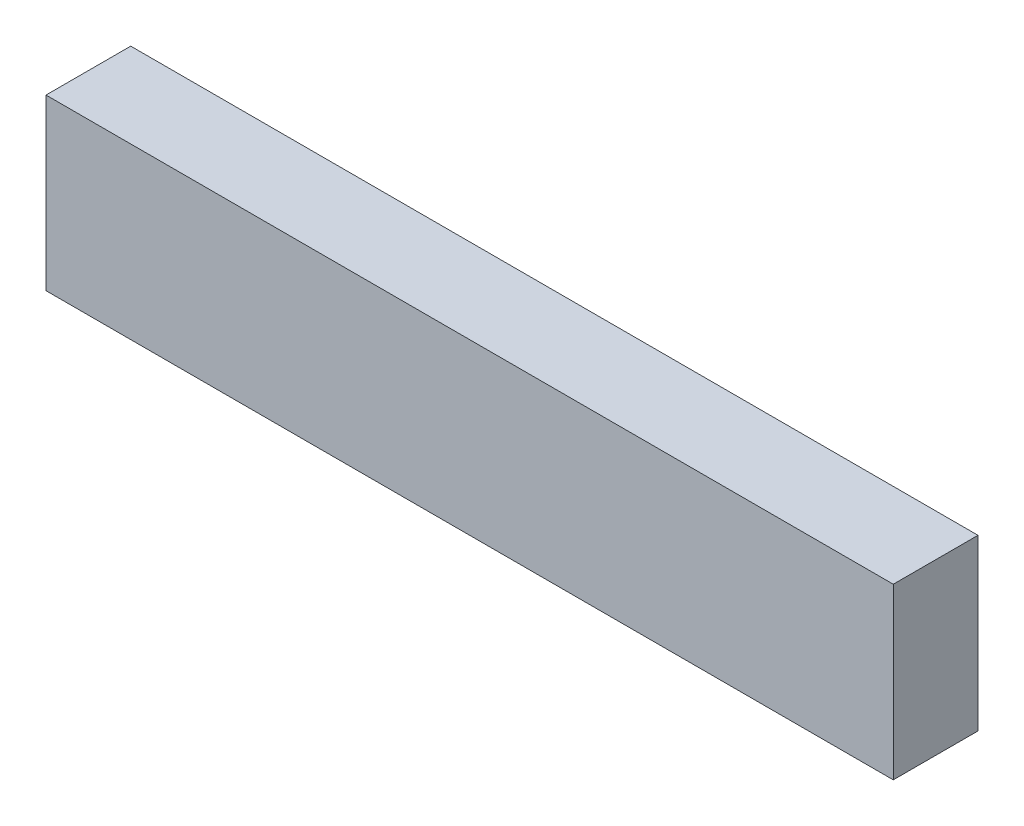
ISO-10303-21;
HEADER;
FILE_DESCRIPTION(('STEP AP214'),'2;1');
FILE_NAME('part.step','',(''),(''),'','','');
FILE_SCHEMA(('AUTOMOTIVE_DESIGN { 1 0 10303 214 1 1 1 1 }'));
ENDSEC;
DATA;
#1=APPLICATION_CONTEXT('core data for automotive mechanical design processes');
#2=APPLICATION_PROTOCOL_DEFINITION('international standard','automotive_design',2000,#1);
#3=PRODUCT_CONTEXT('',#1,'mechanical');
#4=PRODUCT('Part','Part','',(#3));
#5=PRODUCT_RELATED_PRODUCT_CATEGORY('part','',(#4));
#6=PRODUCT_DEFINITION_FORMATION('','',#4);
#7=PRODUCT_DEFINITION_CONTEXT('part definition',#1,'design');
#8=PRODUCT_DEFINITION('design','',#6,#7);
#9=PRODUCT_DEFINITION_SHAPE('','',#8);
#10=(LENGTH_UNIT() NAMED_UNIT(*) SI_UNIT(.MILLI.,.METRE.));
#11=(NAMED_UNIT(*) PLANE_ANGLE_UNIT() SI_UNIT($,.RADIAN.));
#12=(NAMED_UNIT(*) SI_UNIT($,.STERADIAN.) SOLID_ANGLE_UNIT());
#13=UNCERTAINTY_MEASURE_WITH_UNIT(LENGTH_MEASURE(1.E-05),#10,'distance_accuracy_value','');
#14=(GEOMETRIC_REPRESENTATION_CONTEXT(3) GLOBAL_UNCERTAINTY_ASSIGNED_CONTEXT((#13)) GLOBAL_UNIT_ASSIGNED_CONTEXT((#10,
#11,#12)) REPRESENTATION_CONTEXT('',''));
#15=CARTESIAN_POINT('',(0.,0.,0.));
#16=DIRECTION('',(0.,0.,1.));
#17=DIRECTION('',(1.,0.,0.));
#18=AXIS2_PLACEMENT_3D('',#15,#16,#17);
#19=CARTESIAN_POINT('',(50.,10.,5.));
#20=DIRECTION('',(-1.,0.,0.));
#21=DIRECTION('',(0.,0.,1.));
#22=AXIS2_PLACEMENT_3D('',#19,#20,#21);
#23=PLANE('',#22);
#24=DIRECTION('',(0.,0.,-1.));
#25=VECTOR('',#24,1.);
#26=CARTESIAN_POINT('',(50.,-10.,5.));
#27=LINE('',#26,#25);
#28=CARTESIAN_POINT('',(50.,-10.,5.));
#29=VERTEX_POINT('',#28);
#30=CARTESIAN_POINT('',(50.,-10.,-5.));
#31=VERTEX_POINT('',#30);
#32=EDGE_CURVE('E95',#29,#31,#27,.T.);
#33=ORIENTED_EDGE('',*,*,#32,.T.);
#34=DIRECTION('',(0.,-1.,0.));
#35=VECTOR('',#34,1.);
#36=CARTESIAN_POINT('',(50.,10.,-5.));
#37=LINE('',#36,#35);
#38=CARTESIAN_POINT('',(50.,10.,-5.));
#39=VERTEX_POINT('',#38);
#40=EDGE_CURVE('E11',#39,#31,#37,.T.);
#41=ORIENTED_EDGE('',*,*,#40,.F.);
#42=DIRECTION('',(0.,0.,-1.));
#43=VECTOR('',#42,1.);
#44=CARTESIAN_POINT('',(50.,10.,5.));
#45=LINE('',#44,#43);
#46=CARTESIAN_POINT('',(50.,10.,5.));
#47=VERTEX_POINT('',#46);
#48=EDGE_CURVE('E83',#47,#39,#45,.T.);
#49=ORIENTED_EDGE('',*,*,#48,.F.);
#50=DIRECTION('',(0.,-1.,0.));
#51=VECTOR('',#50,1.);
#52=CARTESIAN_POINT('',(50.,10.,5.));
#53=LINE('',#52,#51);
#54=EDGE_CURVE('E91',#47,#29,#53,.T.);
#55=ORIENTED_EDGE('',*,*,#54,.T.);
#56=EDGE_LOOP('',(#33,#41,#49,#55));
#57=FACE_BOUND('',#56,.T.);
#58=ADVANCED_FACE('F32',(#57),#23,.F.);
#59=CARTESIAN_POINT('',(-50.,10.,-5.));
#60=DIRECTION('',(0.,0.,1.));
#61=DIRECTION('',(1.,0.,0.));
#62=AXIS2_PLACEMENT_3D('',#59,#60,#61);
#63=PLANE('',#62);
#64=DIRECTION('',(-1.,0.,0.));
#65=VECTOR('',#64,1.);
#66=CARTESIAN_POINT('',(-50.,-10.,-5.));
#67=LINE('',#66,#65);
#68=CARTESIAN_POINT('',(-50.,-10.,-5.));
#69=VERTEX_POINT('',#68);
#70=EDGE_CURVE('E87',#31,#69,#67,.T.);
#71=ORIENTED_EDGE('',*,*,#70,.T.);
#72=DIRECTION('',(0.,-1.,0.));
#73=VECTOR('',#72,1.);
#74=CARTESIAN_POINT('',(-50.,10.,-5.));
#75=LINE('',#74,#73);
#76=CARTESIAN_POINT('',(-50.,10.,-5.));
#77=VERTEX_POINT('',#76);
#78=EDGE_CURVE('E40',#77,#69,#75,.T.);
#79=ORIENTED_EDGE('',*,*,#78,.F.);
#80=DIRECTION('',(-1.,0.,0.));
#81=VECTOR('',#80,1.);
#82=CARTESIAN_POINT('',(-50.,10.,-5.));
#83=LINE('',#82,#81);
#84=EDGE_CURVE('E78',#39,#77,#83,.T.);
#85=ORIENTED_EDGE('',*,*,#84,.F.);
#86=ORIENTED_EDGE('',*,*,#40,.T.);
#87=EDGE_LOOP('',(#71,#79,#85,#86));
#88=FACE_BOUND('',#87,.T.);
#89=ADVANCED_FACE('F86',(#88),#63,.F.);
#90=CARTESIAN_POINT('',(-50.,10.,5.));
#91=DIRECTION('',(1.,0.,0.));
#92=DIRECTION('',(0.,0.,-1.));
#93=AXIS2_PLACEMENT_3D('',#90,#91,#92);
#94=PLANE('',#93);
#95=DIRECTION('',(0.,0.,1.));
#96=VECTOR('',#95,1.);
#97=CARTESIAN_POINT('',(-50.,-10.,5.));
#98=LINE('',#97,#96);
#99=CARTESIAN_POINT('',(-50.,-10.,5.));
#100=VERTEX_POINT('',#99);
#101=EDGE_CURVE('E65',#69,#100,#98,.T.);
#102=ORIENTED_EDGE('',*,*,#101,.T.);
#103=DIRECTION('',(0.,-1.,0.));
#104=VECTOR('',#103,1.);
#105=CARTESIAN_POINT('',(-50.,10.,5.));
#106=LINE('',#105,#104);
#107=CARTESIAN_POINT('',(-50.,10.,5.));
#108=VERTEX_POINT('',#107);
#109=EDGE_CURVE('E88',#108,#100,#106,.T.);
#110=ORIENTED_EDGE('',*,*,#109,.F.);
#111=DIRECTION('',(0.,0.,1.));
#112=VECTOR('',#111,1.);
#113=CARTESIAN_POINT('',(-50.,10.,5.));
#114=LINE('',#113,#112);
#115=EDGE_CURVE('E81',#77,#108,#114,.T.);
#116=ORIENTED_EDGE('',*,*,#115,.F.);
#117=ORIENTED_EDGE('',*,*,#78,.T.);
#118=EDGE_LOOP('',(#102,#110,#116,#117));
#119=FACE_BOUND('',#118,.T.);
#120=ADVANCED_FACE('F89',(#119),#94,.F.);
#121=CARTESIAN_POINT('',(-50.,10.,5.));
#122=DIRECTION('',(0.,0.,-1.));
#123=DIRECTION('',(-1.,0.,0.));
#124=AXIS2_PLACEMENT_3D('',#121,#122,#123);
#125=PLANE('',#124);
#126=DIRECTION('',(1.,0.,0.));
#127=VECTOR('',#126,1.);
#128=CARTESIAN_POINT('',(-50.,-10.,5.));
#129=LINE('',#128,#127);
#130=EDGE_CURVE('E71',#100,#29,#129,.T.);
#131=ORIENTED_EDGE('',*,*,#130,.T.);
#132=ORIENTED_EDGE('',*,*,#54,.F.);
#133=DIRECTION('',(1.,0.,0.));
#134=VECTOR('',#133,1.);
#135=CARTESIAN_POINT('',(-50.,10.,5.));
#136=LINE('',#135,#134);
#137=EDGE_CURVE('E48',#108,#47,#136,.T.);
#138=ORIENTED_EDGE('',*,*,#137,.F.);
#139=ORIENTED_EDGE('',*,*,#109,.T.);
#140=EDGE_LOOP('',(#131,#132,#138,#139));
#141=FACE_BOUND('',#140,.T.);
#142=ADVANCED_FACE('F102',(#141),#125,.F.);
#143=CARTESIAN_POINT('',(0.,10.,0.));
#144=DIRECTION('',(0.,-1.,0.));
#145=DIRECTION('',(0.,0.,-1.));
#146=AXIS2_PLACEMENT_3D('',#143,#144,#145);
#147=PLANE('',#146);
#148=ORIENTED_EDGE('',*,*,#48,.T.);
#149=ORIENTED_EDGE('',*,*,#84,.T.);
#150=ORIENTED_EDGE('',*,*,#115,.T.);
#151=ORIENTED_EDGE('',*,*,#137,.T.);
#152=EDGE_LOOP('',(#148,#149,#150,#151));
#153=FACE_BOUND('',#152,.T.);
#154=ADVANCED_FACE('F79',(#153),#147,.F.);
#155=CARTESIAN_POINT('',(0.,-10.,0.));
#156=DIRECTION('',(0.,-1.,0.));
#157=DIRECTION('',(0.,0.,-1.));
#158=AXIS2_PLACEMENT_3D('',#155,#156,#157);
#159=PLANE('',#158);
#160=ORIENTED_EDGE('',*,*,#32,.F.);
#161=ORIENTED_EDGE('',*,*,#130,.F.);
#162=ORIENTED_EDGE('',*,*,#101,.F.);
#163=ORIENTED_EDGE('',*,*,#70,.F.);
#164=EDGE_LOOP('',(#160,#161,#162,#163));
#165=FACE_BOUND('',#164,.T.);
#166=ADVANCED_FACE('F105',(#165),#159,.T.);
#167=CLOSED_SHELL('',(#58,#89,#120,#142,#154,#166));
#168=MANIFOLD_SOLID_BREP('B2',#167);
#169=ADVANCED_BREP_SHAPE_REPRESENTATION('',(#18,#168),#14);
#170=SHAPE_DEFINITION_REPRESENTATION(#9,#169);
ENDSEC;
END-ISO-10303-21;
